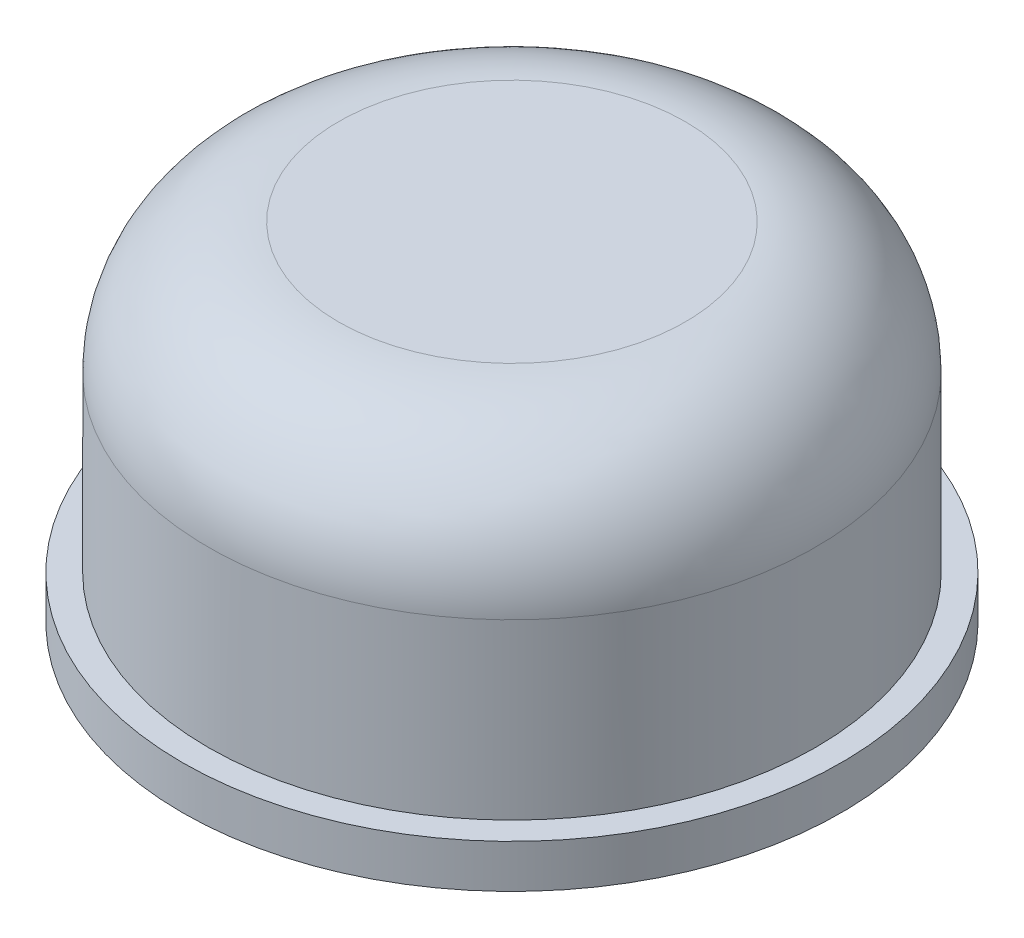
ISO-10303-21;
HEADER;
FILE_DESCRIPTION(('STEP AP214'),'2;1');
FILE_NAME('part.step','',(''),(''),'','','');
FILE_SCHEMA(('AUTOMOTIVE_DESIGN { 1 0 10303 214 1 1 1 1 }'));
ENDSEC;
DATA;
#1=APPLICATION_CONTEXT('core data for automotive mechanical design processes');
#2=APPLICATION_PROTOCOL_DEFINITION('international standard','automotive_design',2000,#1);
#3=PRODUCT_CONTEXT('',#1,'mechanical');
#4=PRODUCT('Part','Part','',(#3));
#5=PRODUCT_RELATED_PRODUCT_CATEGORY('part','',(#4));
#6=PRODUCT_DEFINITION_FORMATION('','',#4);
#7=PRODUCT_DEFINITION_CONTEXT('part definition',#1,'design');
#8=PRODUCT_DEFINITION('design','',#6,#7);
#9=PRODUCT_DEFINITION_SHAPE('','',#8);
#10=(LENGTH_UNIT() NAMED_UNIT(*) SI_UNIT(.MILLI.,.METRE.));
#11=(NAMED_UNIT(*) PLANE_ANGLE_UNIT() SI_UNIT($,.RADIAN.));
#12=(NAMED_UNIT(*) SI_UNIT($,.STERADIAN.) SOLID_ANGLE_UNIT());
#13=UNCERTAINTY_MEASURE_WITH_UNIT(LENGTH_MEASURE(1.E-05),#10,'distance_accuracy_value','');
#14=(GEOMETRIC_REPRESENTATION_CONTEXT(3) GLOBAL_UNCERTAINTY_ASSIGNED_CONTEXT((#13)) GLOBAL_UNIT_ASSIGNED_CONTEXT((#10,
#11,#12)) REPRESENTATION_CONTEXT('',''));
#15=CARTESIAN_POINT('',(0.,0.,0.));
#16=DIRECTION('',(0.,0.,1.));
#17=DIRECTION('',(1.,0.,0.));
#18=AXIS2_PLACEMENT_3D('',#15,#16,#17);
#19=CARTESIAN_POINT('',(0.,0.,0.));
#20=DIRECTION('',(0.,-1.,0.));
#21=DIRECTION('',(0.,0.,-1.));
#22=AXIS2_PLACEMENT_3D('',#19,#20,#21);
#23=PLANE('',#22);
#24=CARTESIAN_POINT('',(0.,0.,0.));
#25=DIRECTION('',(0.,-1.,0.));
#26=DIRECTION('',(0.,0.,-1.));
#27=AXIS2_PLACEMENT_3D('',#24,#25,#26);
#28=CIRCLE('',#27,8.12799999999999);
#29=CARTESIAN_POINT('',(0.,0.,-8.12799999999999));
#30=VERTEX_POINT('',#29);
#31=EDGE_CURVE('E46',#30,#30,#28,.T.);
#32=ORIENTED_EDGE('',*,*,#31,.F.);
#33=EDGE_LOOP('',(#32));
#34=FACE_BOUND('',#33,.T.);
#35=CARTESIAN_POINT('',(0.,0.,0.));
#36=DIRECTION('',(0.,1.,0.));
#37=DIRECTION('',(0.,0.,1.));
#38=AXIS2_PLACEMENT_3D('',#35,#36,#37);
#39=CIRCLE('',#38,9.65199999999999);
#40=CARTESIAN_POINT('',(0.,0.,9.65199999999999));
#41=VERTEX_POINT('',#40);
#42=EDGE_CURVE('E58',#41,#41,#39,.T.);
#43=ORIENTED_EDGE('',*,*,#42,.F.);
#44=EDGE_LOOP('',(#43));
#45=FACE_BOUND('',#44,.T.);
#46=ADVANCED_FACE('F32',(#34,#45),#23,.T.);
#47=CARTESIAN_POINT('',(0.,0.,0.));
#48=DIRECTION('',(0.,-1.,0.));
#49=DIRECTION('',(0.,0.,-1.));
#50=AXIS2_PLACEMENT_3D('',#47,#48,#49);
#51=CYLINDRICAL_SURFACE('',#50,8.12799999999999);
#52=CARTESIAN_POINT('',(0.,5.84200000000001,0.));
#53=DIRECTION('',(0.,-1.,0.));
#54=DIRECTION('',(0.,0.,-1.));
#55=AXIS2_PLACEMENT_3D('',#52,#53,#54);
#56=CIRCLE('',#55,8.12799999999999);
#57=CARTESIAN_POINT('',(0.,5.84200000000001,-8.12799999999999));
#58=VERTEX_POINT('',#57);
#59=EDGE_CURVE('E51',#58,#58,#56,.T.);
#60=ORIENTED_EDGE('',*,*,#59,.F.);
#61=EDGE_LOOP('',(#60));
#62=FACE_BOUND('',#61,.T.);
#63=ORIENTED_EDGE('',*,*,#31,.T.);
#64=EDGE_LOOP('',(#63));
#65=FACE_BOUND('',#64,.T.);
#66=ADVANCED_FACE('F74',(#62,#65),#51,.F.);
#67=CARTESIAN_POINT('',(0.,5.84200000000001,0.));
#68=DIRECTION('',(0.,-1.,0.));
#69=DIRECTION('',(0.,0.,-1.));
#70=AXIS2_PLACEMENT_3D('',#67,#68,#69);
#71=TOROIDAL_SURFACE('',#70,5.07999999999999,3.048);
#72=CARTESIAN_POINT('',(0.,8.89000000000001,0.));
#73=DIRECTION('',(0.,-1.,0.));
#74=DIRECTION('',(0.,0.,-1.));
#75=AXIS2_PLACEMENT_3D('',#72,#73,#74);
#76=CIRCLE('',#75,5.07999999999999);
#77=CARTESIAN_POINT('',(0.,8.89000000000001,-5.07999999999999));
#78=VERTEX_POINT('',#77);
#79=EDGE_CURVE('E54',#78,#78,#76,.T.);
#80=ORIENTED_EDGE('',*,*,#79,.F.);
#81=EDGE_LOOP('',(#80));
#82=FACE_BOUND('',#81,.T.);
#83=ORIENTED_EDGE('',*,*,#59,.T.);
#84=EDGE_LOOP('',(#83));
#85=FACE_BOUND('',#84,.T.);
#86=ADVANCED_FACE('F79',(#82,#85),#71,.F.);
#87=CARTESIAN_POINT('',(-5.07999999999999,8.89000000000001,2.06584931783713E-12));
#88=DIRECTION('',(0.,1.,0.));
#89=DIRECTION('',(0.,0.,1.));
#90=AXIS2_PLACEMENT_3D('',#87,#88,#89);
#91=PLANE('',#90);
#92=ORIENTED_EDGE('',*,*,#79,.T.);
#93=EDGE_LOOP('',(#92));
#94=FACE_BOUND('',#93,.T.);
#95=ADVANCED_FACE('F87',(#94),#91,.F.);
#96=CARTESIAN_POINT('',(0.,1.27,0.));
#97=DIRECTION('',(0.,1.,0.));
#98=DIRECTION('',(0.,0.,1.));
#99=AXIS2_PLACEMENT_3D('',#96,#97,#98);
#100=PLANE('',#99);
#101=CARTESIAN_POINT('',(0.,1.27,0.));
#102=DIRECTION('',(0.,1.,0.));
#103=DIRECTION('',(0.,0.,1.));
#104=AXIS2_PLACEMENT_3D('',#101,#102,#103);
#105=CIRCLE('',#104,9.65199999999999);
#106=CARTESIAN_POINT('',(0.,1.27,9.65199999999999));
#107=VERTEX_POINT('',#106);
#108=EDGE_CURVE('E57',#107,#107,#105,.T.);
#109=ORIENTED_EDGE('',*,*,#108,.T.);
#110=EDGE_LOOP('',(#109));
#111=FACE_BOUND('',#110,.T.);
#112=CARTESIAN_POINT('',(0.,1.27,0.));
#113=DIRECTION('',(0.,1.,0.));
#114=DIRECTION('',(0.,0.,1.));
#115=AXIS2_PLACEMENT_3D('',#112,#113,#114);
#116=CIRCLE('',#115,8.89);
#117=CARTESIAN_POINT('',(0.,1.27,8.89));
#118=VERTEX_POINT('',#117);
#119=EDGE_CURVE('E10',#118,#118,#116,.F.);
#120=ORIENTED_EDGE('',*,*,#119,.T.);
#121=EDGE_LOOP('',(#120));
#122=FACE_BOUND('',#121,.T.);
#123=ADVANCED_FACE('F64',(#111,#122),#100,.T.);
#124=CARTESIAN_POINT('',(0.,1.27,0.));
#125=DIRECTION('',(0.,-1.,0.));
#126=DIRECTION('',(0.,0.,-1.));
#127=AXIS2_PLACEMENT_3D('',#124,#125,#126);
#128=CYLINDRICAL_SURFACE('',#127,9.65199999999999);
#129=ORIENTED_EDGE('',*,*,#108,.F.);
#130=EDGE_LOOP('',(#129));
#131=FACE_BOUND('',#130,.T.);
#132=ORIENTED_EDGE('',*,*,#42,.T.);
#133=EDGE_LOOP('',(#132));
#134=FACE_BOUND('',#133,.T.);
#135=ADVANCED_FACE('F66',(#131,#134),#128,.T.);
#136=CARTESIAN_POINT('',(-5.08,10.16,2.06584931783713E-12));
#137=DIRECTION('',(0.,1.,0.));
#138=DIRECTION('',(0.,0.,1.));
#139=AXIS2_PLACEMENT_3D('',#136,#137,#138);
#140=PLANE('',#139);
#141=CARTESIAN_POINT('',(0.,10.16,0.));
#142=DIRECTION('',(0.,-1.,0.));
#143=DIRECTION('',(0.,0.,-1.));
#144=AXIS2_PLACEMENT_3D('',#141,#142,#143);
#145=CIRCLE('',#144,5.08);
#146=CARTESIAN_POINT('',(0.,10.16,-5.08));
#147=VERTEX_POINT('',#146);
#148=EDGE_CURVE('E42',#147,#147,#145,.T.);
#149=ORIENTED_EDGE('',*,*,#148,.F.);
#150=EDGE_LOOP('',(#149));
#151=FACE_BOUND('',#150,.T.);
#152=ADVANCED_FACE('F69',(#151),#140,.T.);
#153=CARTESIAN_POINT('',(0.,6.35000000000001,0.));
#154=DIRECTION('',(0.,-1.,0.));
#155=DIRECTION('',(0.,0.,-1.));
#156=AXIS2_PLACEMENT_3D('',#153,#154,#155);
#157=TOROIDAL_SURFACE('',#156,5.08,3.81);
#158=ORIENTED_EDGE('',*,*,#148,.T.);
#159=EDGE_LOOP('',(#158));
#160=FACE_BOUND('',#159,.T.);
#161=CARTESIAN_POINT('',(0.,6.35000000000001,0.));
#162=DIRECTION('',(0.,-1.,0.));
#163=DIRECTION('',(0.,0.,-1.));
#164=AXIS2_PLACEMENT_3D('',#161,#162,#163);
#165=CIRCLE('',#164,8.89);
#166=CARTESIAN_POINT('',(0.,6.35000000000001,-8.89));
#167=VERTEX_POINT('',#166);
#168=EDGE_CURVE('E38',#167,#167,#165,.T.);
#169=ORIENTED_EDGE('',*,*,#168,.F.);
#170=EDGE_LOOP('',(#169));
#171=FACE_BOUND('',#170,.T.);
#172=ADVANCED_FACE('F95',(#160,#171),#157,.T.);
#173=CARTESIAN_POINT('',(0.,0.,0.));
#174=DIRECTION('',(0.,-1.,0.));
#175=DIRECTION('',(0.,0.,-1.));
#176=AXIS2_PLACEMENT_3D('',#173,#174,#175);
#177=CYLINDRICAL_SURFACE('',#176,8.89);
#178=ORIENTED_EDGE('',*,*,#119,.F.);
#179=EDGE_LOOP('',(#178));
#180=FACE_BOUND('',#179,.T.);
#181=ORIENTED_EDGE('',*,*,#168,.T.);
#182=EDGE_LOOP('',(#181));
#183=FACE_BOUND('',#182,.T.);
#184=ADVANCED_FACE('F98',(#180,#183),#177,.T.);
#185=CLOSED_SHELL('',(#46,#66,#86,#95,#123,#135,#152,#172,#184));
#186=MANIFOLD_SOLID_BREP('B2',#185);
#187=ADVANCED_BREP_SHAPE_REPRESENTATION('',(#18,#186),#14);
#188=SHAPE_DEFINITION_REPRESENTATION(#9,#187);
ENDSEC;
END-ISO-10303-21;
